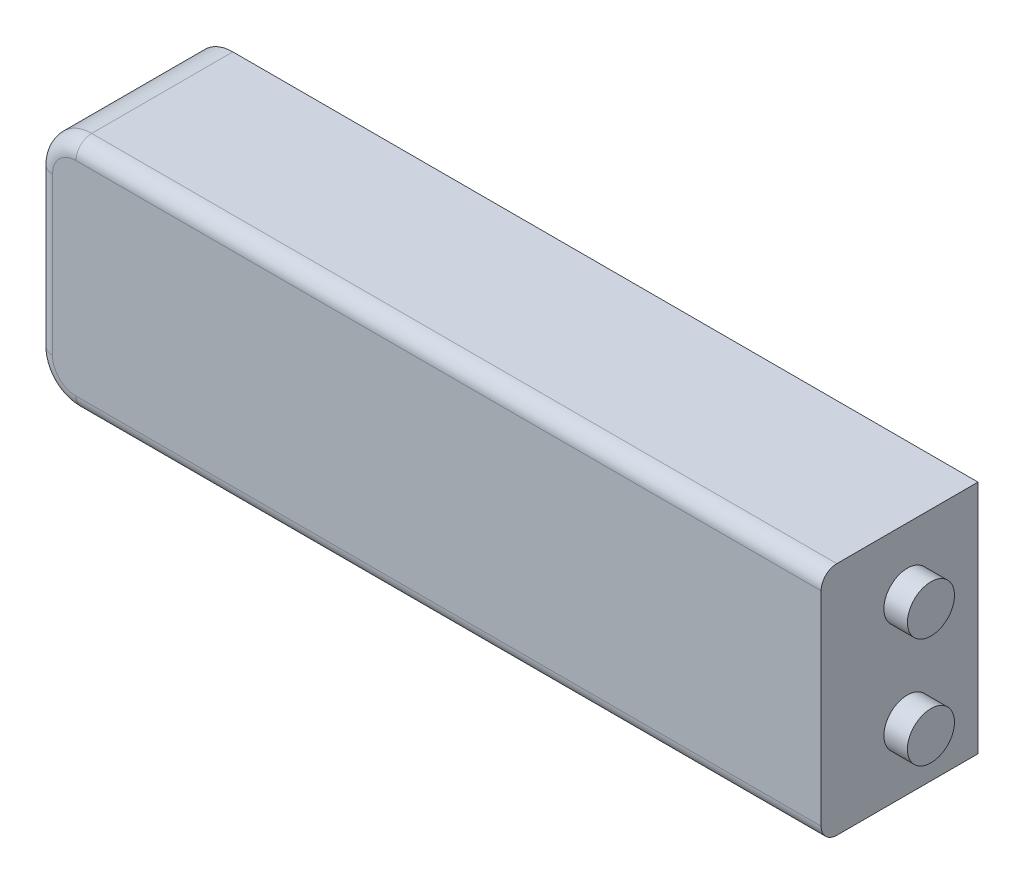
ISO-10303-21;
HEADER;
FILE_DESCRIPTION(('STEP AP214'),'2;1');
FILE_NAME('part.step','',(''),(''),'','','');
FILE_SCHEMA(('AUTOMOTIVE_DESIGN { 1 0 10303 214 1 1 1 1 }'));
ENDSEC;
DATA;
#1=APPLICATION_CONTEXT('core data for automotive mechanical design processes');
#2=APPLICATION_PROTOCOL_DEFINITION('international standard','automotive_design',2000,#1);
#3=PRODUCT_CONTEXT('',#1,'mechanical');
#4=PRODUCT('Part','Part','',(#3));
#5=PRODUCT_RELATED_PRODUCT_CATEGORY('part','',(#4));
#6=PRODUCT_DEFINITION_FORMATION('','',#4);
#7=PRODUCT_DEFINITION_CONTEXT('part definition',#1,'design');
#8=PRODUCT_DEFINITION('design','',#6,#7);
#9=PRODUCT_DEFINITION_SHAPE('','',#8);
#10=(LENGTH_UNIT() NAMED_UNIT(*) SI_UNIT(.MILLI.,.METRE.));
#11=(NAMED_UNIT(*) PLANE_ANGLE_UNIT() SI_UNIT($,.RADIAN.));
#12=(NAMED_UNIT(*) SI_UNIT($,.STERADIAN.) SOLID_ANGLE_UNIT());
#13=UNCERTAINTY_MEASURE_WITH_UNIT(LENGTH_MEASURE(1.E-05),#10,'distance_accuracy_value','');
#14=(GEOMETRIC_REPRESENTATION_CONTEXT(3) GLOBAL_UNCERTAINTY_ASSIGNED_CONTEXT((#13)) GLOBAL_UNIT_ASSIGNED_CONTEXT((#10,
#11,#12)) REPRESENTATION_CONTEXT('',''));
#15=CARTESIAN_POINT('',(0.,0.,0.));
#16=DIRECTION('',(0.,0.,1.));
#17=DIRECTION('',(1.,0.,0.));
#18=AXIS2_PLACEMENT_3D('',#15,#16,#17);
#19=CARTESIAN_POINT('',(0.,0.,20.));
#20=DIRECTION('',(-1.,0.,0.));
#21=DIRECTION('',(0.,0.,1.));
#22=AXIS2_PLACEMENT_3D('',#19,#20,#21);
#23=PLANE('',#22);
#24=CARTESIAN_POINT('',(0.,8.,9.));
#25=DIRECTION('',(-1.,0.,0.));
#26=DIRECTION('',(0.,0.,1.));
#27=AXIS2_PLACEMENT_3D('',#24,#25,#26);
#28=CIRCLE('',#27,3.);
#29=CARTESIAN_POINT('',(0.,8.,12.));
#30=VERTEX_POINT('',#29);
#31=EDGE_CURVE('E159',#30,#30,#28,.F.);
#32=ORIENTED_EDGE('',*,*,#31,.F.);
#33=EDGE_LOOP('',(#32));
#34=FACE_BOUND('',#33,.T.);
#35=CARTESIAN_POINT('',(0.,22.,9.));
#36=DIRECTION('',(-1.,0.,0.));
#37=DIRECTION('',(0.,0.,1.));
#38=AXIS2_PLACEMENT_3D('',#35,#36,#37);
#39=CIRCLE('',#38,3.);
#40=CARTESIAN_POINT('',(0.,22.,12.));
#41=VERTEX_POINT('',#40);
#42=EDGE_CURVE('E116',#41,#41,#39,.F.);
#43=ORIENTED_EDGE('',*,*,#42,.F.);
#44=EDGE_LOOP('',(#43));
#45=FACE_BOUND('',#44,.T.);
#46=DIRECTION('',(0.,1.,0.));
#47=VECTOR('',#46,1.);
#48=CARTESIAN_POINT('',(0.,0.,20.));
#49=LINE('',#48,#47);
#50=CARTESIAN_POINT('',(0.,2.,20.));
#51=VERTEX_POINT('',#50);
#52=CARTESIAN_POINT('',(0.,28.,20.));
#53=VERTEX_POINT('',#52);
#54=EDGE_CURVE('E138',#51,#53,#49,.T.);
#55=ORIENTED_EDGE('',*,*,#54,.F.);
#56=CARTESIAN_POINT('',(0.,2.,18.));
#57=DIRECTION('',(-1.,0.,0.));
#58=DIRECTION('',(0.,0.,1.));
#59=AXIS2_PLACEMENT_3D('',#56,#57,#58);
#60=CIRCLE('',#59,2.);
#61=CARTESIAN_POINT('',(0.,0.,18.));
#62=VERTEX_POINT('',#61);
#63=EDGE_CURVE('E175',#51,#62,#60,.F.);
#64=ORIENTED_EDGE('',*,*,#63,.T.);
#65=DIRECTION('',(0.,0.,-1.));
#66=VECTOR('',#65,1.);
#67=CARTESIAN_POINT('',(0.,0.,20.));
#68=LINE('',#67,#66);
#69=CARTESIAN_POINT('',(0.,0.,0.));
#70=VERTEX_POINT('',#69);
#71=EDGE_CURVE('E130',#62,#70,#68,.T.);
#72=ORIENTED_EDGE('',*,*,#71,.T.);
#73=DIRECTION('',(0.,1.,0.));
#74=VECTOR('',#73,1.);
#75=CARTESIAN_POINT('',(0.,0.,0.));
#76=LINE('',#75,#74);
#77=CARTESIAN_POINT('',(0.,30.,0.));
#78=VERTEX_POINT('',#77);
#79=EDGE_CURVE('E123',#70,#78,#76,.T.);
#80=ORIENTED_EDGE('',*,*,#79,.T.);
#81=DIRECTION('',(0.,0.,-1.));
#82=VECTOR('',#81,1.);
#83=CARTESIAN_POINT('',(0.,30.,20.));
#84=LINE('',#83,#82);
#85=CARTESIAN_POINT('',(0.,30.,18.));
#86=VERTEX_POINT('',#85);
#87=EDGE_CURVE('E107',#86,#78,#84,.T.);
#88=ORIENTED_EDGE('',*,*,#87,.F.);
#89=CARTESIAN_POINT('',(0.,28.,18.));
#90=DIRECTION('',(-1.,0.,0.));
#91=DIRECTION('',(0.,0.,1.));
#92=AXIS2_PLACEMENT_3D('',#89,#90,#91);
#93=CIRCLE('',#92,2.);
#94=EDGE_CURVE('E173',#86,#53,#93,.F.);
#95=ORIENTED_EDGE('',*,*,#94,.T.);
#96=EDGE_LOOP('',(#55,#64,#72,#80,#88,#95));
#97=FACE_BOUND('',#96,.T.);
#98=ADVANCED_FACE('F35',(#34,#45,#97),#23,.F.);
#99=CARTESIAN_POINT('',(0.,30.,20.));
#100=DIRECTION('',(0.,-1.,0.));
#101=DIRECTION('',(1.,0.,0.));
#102=AXIS2_PLACEMENT_3D('',#99,#100,#101);
#103=PLANE('',#102);
#104=DIRECTION('',(0.,0.,-1.));
#105=VECTOR('',#104,1.);
#106=CARTESIAN_POINT('',(-95.,30.,20.));
#107=LINE('',#106,#105);
#108=CARTESIAN_POINT('',(-95.,30.,18.));
#109=VERTEX_POINT('',#108);
#110=CARTESIAN_POINT('',(-95.,30.,0.));
#111=VERTEX_POINT('',#110);
#112=EDGE_CURVE('E117',#109,#111,#107,.T.);
#113=ORIENTED_EDGE('',*,*,#112,.F.);
#114=DIRECTION('',(-1.,0.,0.));
#115=VECTOR('',#114,1.);
#116=CARTESIAN_POINT('',(0.,30.,18.));
#117=LINE('',#116,#115);
#118=EDGE_CURVE('E11',#109,#86,#117,.F.);
#119=ORIENTED_EDGE('',*,*,#118,.T.);
#120=ORIENTED_EDGE('',*,*,#87,.T.);
#121=DIRECTION('',(-1.,0.,0.));
#122=VECTOR('',#121,1.);
#123=CARTESIAN_POINT('',(0.,30.,0.));
#124=LINE('',#123,#122);
#125=EDGE_CURVE('E110',#78,#111,#124,.T.);
#126=ORIENTED_EDGE('',*,*,#125,.T.);
#127=EDGE_LOOP('',(#113,#119,#120,#126));
#128=FACE_BOUND('',#127,.T.);
#129=ADVANCED_FACE('F109',(#128),#103,.F.);
#130=CARTESIAN_POINT('',(-95.,25.,20.));
#131=DIRECTION('',(0.,0.,-1.));
#132=DIRECTION('',(-1.,0.,0.));
#133=AXIS2_PLACEMENT_3D('',#130,#131,#132);
#134=CYLINDRICAL_SURFACE('',#133,5.);
#135=DIRECTION('',(0.,0.,-1.));
#136=VECTOR('',#135,1.);
#137=CARTESIAN_POINT('',(-100.,25.,20.));
#138=LINE('',#137,#136);
#139=CARTESIAN_POINT('',(-100.,25.,18.));
#140=VERTEX_POINT('',#139);
#141=CARTESIAN_POINT('',(-100.,25.,0.));
#142=VERTEX_POINT('',#141);
#143=EDGE_CURVE('E154',#140,#142,#138,.T.);
#144=ORIENTED_EDGE('',*,*,#143,.F.);
#145=CARTESIAN_POINT('',(-95.,25.,18.));
#146=DIRECTION('',(0.,0.,1.));
#147=DIRECTION('',(1.,0.,0.));
#148=AXIS2_PLACEMENT_3D('',#145,#146,#147);
#149=CIRCLE('',#148,5.);
#150=EDGE_CURVE('E44',#140,#109,#149,.F.);
#151=ORIENTED_EDGE('',*,*,#150,.T.);
#152=ORIENTED_EDGE('',*,*,#112,.T.);
#153=CARTESIAN_POINT('',(-95.,25.,0.));
#154=DIRECTION('',(0.,0.,1.));
#155=DIRECTION('',(1.,0.,0.));
#156=AXIS2_PLACEMENT_3D('',#153,#154,#155);
#157=CIRCLE('',#156,5.);
#158=EDGE_CURVE('E126',#111,#142,#157,.T.);
#159=ORIENTED_EDGE('',*,*,#158,.T.);
#160=EDGE_LOOP('',(#144,#151,#152,#159));
#161=FACE_BOUND('',#160,.T.);
#162=ADVANCED_FACE('F244',(#161),#134,.T.);
#163=CARTESIAN_POINT('',(-100.,4.99999999999999,20.));
#164=DIRECTION('',(1.,0.,0.));
#165=DIRECTION('',(0.,0.,-1.));
#166=AXIS2_PLACEMENT_3D('',#163,#164,#165);
#167=PLANE('',#166);
#168=DIRECTION('',(0.,0.,-1.));
#169=VECTOR('',#168,1.);
#170=CARTESIAN_POINT('',(-100.,4.99999999999999,20.));
#171=LINE('',#170,#169);
#172=CARTESIAN_POINT('',(-100.,4.99999999999999,18.));
#173=VERTEX_POINT('',#172);
#174=CARTESIAN_POINT('',(-100.,4.99999999999999,0.));
#175=VERTEX_POINT('',#174);
#176=EDGE_CURVE('E152',#173,#175,#171,.T.);
#177=ORIENTED_EDGE('',*,*,#176,.F.);
#178=DIRECTION('',(0.,-1.,0.));
#179=VECTOR('',#178,1.);
#180=CARTESIAN_POINT('',(-100.,25.,18.));
#181=LINE('',#180,#179);
#182=EDGE_CURVE('E59',#173,#140,#181,.F.);
#183=ORIENTED_EDGE('',*,*,#182,.T.);
#184=ORIENTED_EDGE('',*,*,#143,.T.);
#185=DIRECTION('',(0.,-1.,0.));
#186=VECTOR('',#185,1.);
#187=CARTESIAN_POINT('',(-100.,4.99999999999999,0.));
#188=LINE('',#187,#186);
#189=EDGE_CURVE('E141',#142,#175,#188,.T.);
#190=ORIENTED_EDGE('',*,*,#189,.T.);
#191=EDGE_LOOP('',(#177,#183,#184,#190));
#192=FACE_BOUND('',#191,.T.);
#193=ADVANCED_FACE('F240',(#192),#167,.F.);
#194=CARTESIAN_POINT('',(-95.,4.99999999999999,20.));
#195=DIRECTION('',(0.,0.,-1.));
#196=DIRECTION('',(-1.,0.,0.));
#197=AXIS2_PLACEMENT_3D('',#194,#195,#196);
#198=CYLINDRICAL_SURFACE('',#197,5.);
#199=DIRECTION('',(0.,0.,-1.));
#200=VECTOR('',#199,1.);
#201=CARTESIAN_POINT('',(-95.,0.,20.));
#202=LINE('',#201,#200);
#203=CARTESIAN_POINT('',(-95.,0.,18.));
#204=VERTEX_POINT('',#203);
#205=CARTESIAN_POINT('',(-95.,0.,0.));
#206=VERTEX_POINT('',#205);
#207=EDGE_CURVE('E150',#204,#206,#202,.T.);
#208=ORIENTED_EDGE('',*,*,#207,.F.);
#209=CARTESIAN_POINT('',(-95.,4.99999999999999,18.));
#210=DIRECTION('',(0.,0.,1.));
#211=DIRECTION('',(1.,0.,0.));
#212=AXIS2_PLACEMENT_3D('',#209,#210,#211);
#213=CIRCLE('',#212,5.);
#214=EDGE_CURVE('E179',#204,#173,#213,.F.);
#215=ORIENTED_EDGE('',*,*,#214,.T.);
#216=ORIENTED_EDGE('',*,*,#176,.T.);
#217=CARTESIAN_POINT('',(-95.,4.99999999999999,0.));
#218=DIRECTION('',(0.,0.,1.));
#219=DIRECTION('',(-1.,0.,0.));
#220=AXIS2_PLACEMENT_3D('',#217,#218,#219);
#221=CIRCLE('',#220,5.);
#222=EDGE_CURVE('E144',#175,#206,#221,.T.);
#223=ORIENTED_EDGE('',*,*,#222,.T.);
#224=EDGE_LOOP('',(#208,#215,#216,#223));
#225=FACE_BOUND('',#224,.T.);
#226=ADVANCED_FACE('F236',(#225),#198,.T.);
#227=CARTESIAN_POINT('',(0.,0.,20.));
#228=DIRECTION('',(0.,1.,0.));
#229=DIRECTION('',(-1.,0.,0.));
#230=AXIS2_PLACEMENT_3D('',#227,#228,#229);
#231=PLANE('',#230);
#232=ORIENTED_EDGE('',*,*,#71,.F.);
#233=DIRECTION('',(1.,0.,0.));
#234=VECTOR('',#233,1.);
#235=CARTESIAN_POINT('',(-95.,0.,18.));
#236=LINE('',#235,#234);
#237=EDGE_CURVE('E177',#62,#204,#236,.F.);
#238=ORIENTED_EDGE('',*,*,#237,.T.);
#239=ORIENTED_EDGE('',*,*,#207,.T.);
#240=DIRECTION('',(1.,0.,0.));
#241=VECTOR('',#240,1.);
#242=CARTESIAN_POINT('',(0.,0.,0.));
#243=LINE('',#242,#241);
#244=EDGE_CURVE('E147',#206,#70,#243,.T.);
#245=ORIENTED_EDGE('',*,*,#244,.T.);
#246=EDGE_LOOP('',(#232,#238,#239,#245));
#247=FACE_BOUND('',#246,.T.);
#248=ADVANCED_FACE('F231',(#247),#231,.F.);
#249=CARTESIAN_POINT('',(-95.,25.,20.));
#250=DIRECTION('',(0.,0.,1.));
#251=DIRECTION('',(1.,0.,0.));
#252=AXIS2_PLACEMENT_3D('',#249,#250,#251);
#253=PLANE('',#252);
#254=CARTESIAN_POINT('',(-95.,4.99999999999999,20.));
#255=DIRECTION('',(0.,0.,1.));
#256=DIRECTION('',(1.,0.,0.));
#257=AXIS2_PLACEMENT_3D('',#254,#255,#256);
#258=CIRCLE('',#257,3.);
#259=CARTESIAN_POINT('',(-98.,4.99999999999999,20.));
#260=VERTEX_POINT('',#259);
#261=CARTESIAN_POINT('',(-95.,1.99999999999999,20.));
#262=VERTEX_POINT('',#261);
#263=EDGE_CURVE('E168',#260,#262,#258,.T.);
#264=ORIENTED_EDGE('',*,*,#263,.T.);
#265=DIRECTION('',(1.,0.,0.));
#266=VECTOR('',#265,1.);
#267=CARTESIAN_POINT('',(0.,2.,20.));
#268=LINE('',#267,#266);
#269=EDGE_CURVE('E170',#262,#51,#268,.T.);
#270=ORIENTED_EDGE('',*,*,#269,.T.);
#271=ORIENTED_EDGE('',*,*,#54,.T.);
#272=DIRECTION('',(-1.,0.,0.));
#273=VECTOR('',#272,1.);
#274=CARTESIAN_POINT('',(-95.,28.,20.));
#275=LINE('',#274,#273);
#276=CARTESIAN_POINT('',(-95.,28.,20.));
#277=VERTEX_POINT('',#276);
#278=EDGE_CURVE('E162',#53,#277,#275,.T.);
#279=ORIENTED_EDGE('',*,*,#278,.T.);
#280=CARTESIAN_POINT('',(-95.,25.,20.));
#281=DIRECTION('',(0.,0.,1.));
#282=DIRECTION('',(1.,0.,0.));
#283=AXIS2_PLACEMENT_3D('',#280,#281,#282);
#284=CIRCLE('',#283,3.);
#285=CARTESIAN_POINT('',(-98.,25.,20.));
#286=VERTEX_POINT('',#285);
#287=EDGE_CURVE('E164',#277,#286,#284,.T.);
#288=ORIENTED_EDGE('',*,*,#287,.T.);
#289=DIRECTION('',(0.,-1.,0.));
#290=VECTOR('',#289,1.);
#291=CARTESIAN_POINT('',(-98.,4.99999999999999,20.));
#292=LINE('',#291,#290);
#293=EDGE_CURVE('E166',#286,#260,#292,.T.);
#294=ORIENTED_EDGE('',*,*,#293,.T.);
#295=EDGE_LOOP('',(#264,#270,#271,#279,#288,#294));
#296=FACE_BOUND('',#295,.T.);
#297=ADVANCED_FACE('F225',(#296),#253,.T.);
#298=CARTESIAN_POINT('',(-95.,25.,0.));
#299=DIRECTION('',(0.,0.,1.));
#300=DIRECTION('',(1.,0.,0.));
#301=AXIS2_PLACEMENT_3D('',#298,#299,#300);
#302=PLANE('',#301);
#303=ORIENTED_EDGE('',*,*,#79,.F.);
#304=ORIENTED_EDGE('',*,*,#244,.F.);
#305=ORIENTED_EDGE('',*,*,#222,.F.);
#306=ORIENTED_EDGE('',*,*,#189,.F.);
#307=ORIENTED_EDGE('',*,*,#158,.F.);
#308=ORIENTED_EDGE('',*,*,#125,.F.);
#309=EDGE_LOOP('',(#303,#304,#305,#306,#307,#308));
#310=FACE_BOUND('',#309,.T.);
#311=ADVANCED_FACE('F121',(#310),#302,.F.);
#312=CARTESIAN_POINT('',(3.,22.,9.));
#313=DIRECTION('',(-1.,0.,0.));
#314=DIRECTION('',(0.,0.,1.));
#315=AXIS2_PLACEMENT_3D('',#312,#313,#314);
#316=CYLINDRICAL_SURFACE('',#315,3.);
#317=CARTESIAN_POINT('',(3.,22.,9.));
#318=DIRECTION('',(1.,0.,0.));
#319=DIRECTION('',(0.,0.,-1.));
#320=AXIS2_PLACEMENT_3D('',#317,#318,#319);
#321=CIRCLE('',#320,3.);
#322=CARTESIAN_POINT('',(3.,22.,6.));
#323=VERTEX_POINT('',#322);
#324=EDGE_CURVE('E132',#323,#323,#321,.T.);
#325=ORIENTED_EDGE('',*,*,#324,.F.);
#326=EDGE_LOOP('',(#325));
#327=FACE_BOUND('',#326,.T.);
#328=ORIENTED_EDGE('',*,*,#42,.T.);
#329=EDGE_LOOP('',(#328));
#330=FACE_BOUND('',#329,.T.);
#331=ADVANCED_FACE('F215',(#327,#330),#316,.T.);
#332=CARTESIAN_POINT('',(3.,22.,9.));
#333=DIRECTION('',(1.,0.,0.));
#334=DIRECTION('',(0.,0.,-1.));
#335=AXIS2_PLACEMENT_3D('',#332,#333,#334);
#336=PLANE('',#335);
#337=ORIENTED_EDGE('',*,*,#324,.T.);
#338=EDGE_LOOP('',(#337));
#339=FACE_BOUND('',#338,.T.);
#340=ADVANCED_FACE('F206',(#339),#336,.T.);
#341=CARTESIAN_POINT('',(3.,8.,9.));
#342=DIRECTION('',(-1.,0.,0.));
#343=DIRECTION('',(0.,0.,1.));
#344=AXIS2_PLACEMENT_3D('',#341,#342,#343);
#345=CYLINDRICAL_SURFACE('',#344,3.);
#346=CARTESIAN_POINT('',(3.,8.,9.));
#347=DIRECTION('',(1.,0.,0.));
#348=DIRECTION('',(0.,0.,-1.));
#349=AXIS2_PLACEMENT_3D('',#346,#347,#348);
#350=CIRCLE('',#349,3.);
#351=CARTESIAN_POINT('',(3.,8.,6.));
#352=VERTEX_POINT('',#351);
#353=EDGE_CURVE('E135',#352,#352,#350,.T.);
#354=ORIENTED_EDGE('',*,*,#353,.F.);
#355=EDGE_LOOP('',(#354));
#356=FACE_BOUND('',#355,.T.);
#357=ORIENTED_EDGE('',*,*,#31,.T.);
#358=EDGE_LOOP('',(#357));
#359=FACE_BOUND('',#358,.T.);
#360=ADVANCED_FACE('F203',(#356,#359),#345,.T.);
#361=CARTESIAN_POINT('',(3.,8.,9.));
#362=DIRECTION('',(1.,0.,0.));
#363=DIRECTION('',(0.,0.,-1.));
#364=AXIS2_PLACEMENT_3D('',#361,#362,#363);
#365=PLANE('',#364);
#366=ORIENTED_EDGE('',*,*,#353,.T.);
#367=EDGE_LOOP('',(#366));
#368=FACE_BOUND('',#367,.T.);
#369=ADVANCED_FACE('F201',(#368),#365,.T.);
#370=CARTESIAN_POINT('',(-95.,28.,18.));
#371=DIRECTION('',(1.,0.,0.));
#372=DIRECTION('',(0.,1.,0.));
#373=AXIS2_PLACEMENT_3D('',#370,#371,#372);
#374=CYLINDRICAL_SURFACE('',#373,2.);
#375=ORIENTED_EDGE('',*,*,#94,.F.);
#376=ORIENTED_EDGE('',*,*,#118,.F.);
#377=CARTESIAN_POINT('',(-95.,28.,18.));
#378=DIRECTION('',(-1.,0.,0.));
#379=DIRECTION('',(0.,0.,1.));
#380=AXIS2_PLACEMENT_3D('',#377,#378,#379);
#381=CIRCLE('',#380,2.);
#382=EDGE_CURVE('E39',#277,#109,#381,.T.);
#383=ORIENTED_EDGE('',*,*,#382,.F.);
#384=ORIENTED_EDGE('',*,*,#278,.F.);
#385=EDGE_LOOP('',(#375,#376,#383,#384));
#386=FACE_BOUND('',#385,.T.);
#387=ADVANCED_FACE('F37',(#386),#374,.T.);
#388=CARTESIAN_POINT('',(-95.,25.,18.));
#389=DIRECTION('',(0.,0.,1.));
#390=DIRECTION('',(1.,0.,0.));
#391=AXIS2_PLACEMENT_3D('',#388,#389,#390);
#392=TOROIDAL_SURFACE('',#391,3.,2.);
#393=ORIENTED_EDGE('',*,*,#382,.T.);
#394=ORIENTED_EDGE('',*,*,#150,.F.);
#395=CARTESIAN_POINT('',(-98.,25.,18.));
#396=DIRECTION('',(0.,-1.,0.));
#397=DIRECTION('',(0.,0.,-1.));
#398=AXIS2_PLACEMENT_3D('',#395,#396,#397);
#399=CIRCLE('',#398,2.);
#400=EDGE_CURVE('E188',#286,#140,#399,.T.);
#401=ORIENTED_EDGE('',*,*,#400,.F.);
#402=ORIENTED_EDGE('',*,*,#287,.F.);
#403=EDGE_LOOP('',(#393,#394,#401,#402));
#404=FACE_BOUND('',#403,.T.);
#405=ADVANCED_FACE('F259',(#404),#392,.T.);
#406=CARTESIAN_POINT('',(-98.,25.,18.));
#407=DIRECTION('',(0.,1.,0.));
#408=DIRECTION('',(0.,0.,1.));
#409=AXIS2_PLACEMENT_3D('',#406,#407,#408);
#410=CYLINDRICAL_SURFACE('',#409,2.);
#411=ORIENTED_EDGE('',*,*,#400,.T.);
#412=ORIENTED_EDGE('',*,*,#182,.F.);
#413=CARTESIAN_POINT('',(-98.,4.99999999999999,18.));
#414=DIRECTION('',(0.,-1.,0.));
#415=DIRECTION('',(0.,0.,-1.));
#416=AXIS2_PLACEMENT_3D('',#413,#414,#415);
#417=CIRCLE('',#416,2.);
#418=EDGE_CURVE('E186',#260,#173,#417,.T.);
#419=ORIENTED_EDGE('',*,*,#418,.F.);
#420=ORIENTED_EDGE('',*,*,#293,.F.);
#421=EDGE_LOOP('',(#411,#412,#419,#420));
#422=FACE_BOUND('',#421,.T.);
#423=ADVANCED_FACE('F256',(#422),#410,.T.);
#424=CARTESIAN_POINT('',(-95.,4.99999999999999,18.));
#425=DIRECTION('',(0.,0.,1.));
#426=DIRECTION('',(1.,0.,0.));
#427=AXIS2_PLACEMENT_3D('',#424,#425,#426);
#428=TOROIDAL_SURFACE('',#427,3.,2.);
#429=ORIENTED_EDGE('',*,*,#418,.T.);
#430=ORIENTED_EDGE('',*,*,#214,.F.);
#431=CARTESIAN_POINT('',(-95.,1.99999999999999,18.));
#432=DIRECTION('',(1.,0.,0.));
#433=DIRECTION('',(0.,0.,-1.));
#434=AXIS2_PLACEMENT_3D('',#431,#432,#433);
#435=CIRCLE('',#434,2.);
#436=EDGE_CURVE('E183',#262,#204,#435,.T.);
#437=ORIENTED_EDGE('',*,*,#436,.F.);
#438=ORIENTED_EDGE('',*,*,#263,.F.);
#439=EDGE_LOOP('',(#429,#430,#437,#438));
#440=FACE_BOUND('',#439,.T.);
#441=ADVANCED_FACE('F252',(#440),#428,.T.);
#442=CARTESIAN_POINT('',(-95.,1.99999999999999,18.));
#443=DIRECTION('',(-1.,0.,0.));
#444=DIRECTION('',(0.,-1.,0.));
#445=AXIS2_PLACEMENT_3D('',#442,#443,#444);
#446=CYLINDRICAL_SURFACE('',#445,2.);
#447=ORIENTED_EDGE('',*,*,#436,.T.);
#448=ORIENTED_EDGE('',*,*,#237,.F.);
#449=ORIENTED_EDGE('',*,*,#63,.F.);
#450=ORIENTED_EDGE('',*,*,#269,.F.);
#451=EDGE_LOOP('',(#447,#448,#449,#450));
#452=FACE_BOUND('',#451,.T.);
#453=ADVANCED_FACE('F249',(#452),#446,.T.);
#454=CLOSED_SHELL('',(#98,#129,#162,#193,#226,#248,#297,#311,#331,#340,#360,#369,#387,#405,#423,
#441,#453));
#455=MANIFOLD_SOLID_BREP('B2',#454);
#456=ADVANCED_BREP_SHAPE_REPRESENTATION('',(#18,#455),#14);
#457=SHAPE_DEFINITION_REPRESENTATION(#9,#456);
ENDSEC;
END-ISO-10303-21;
